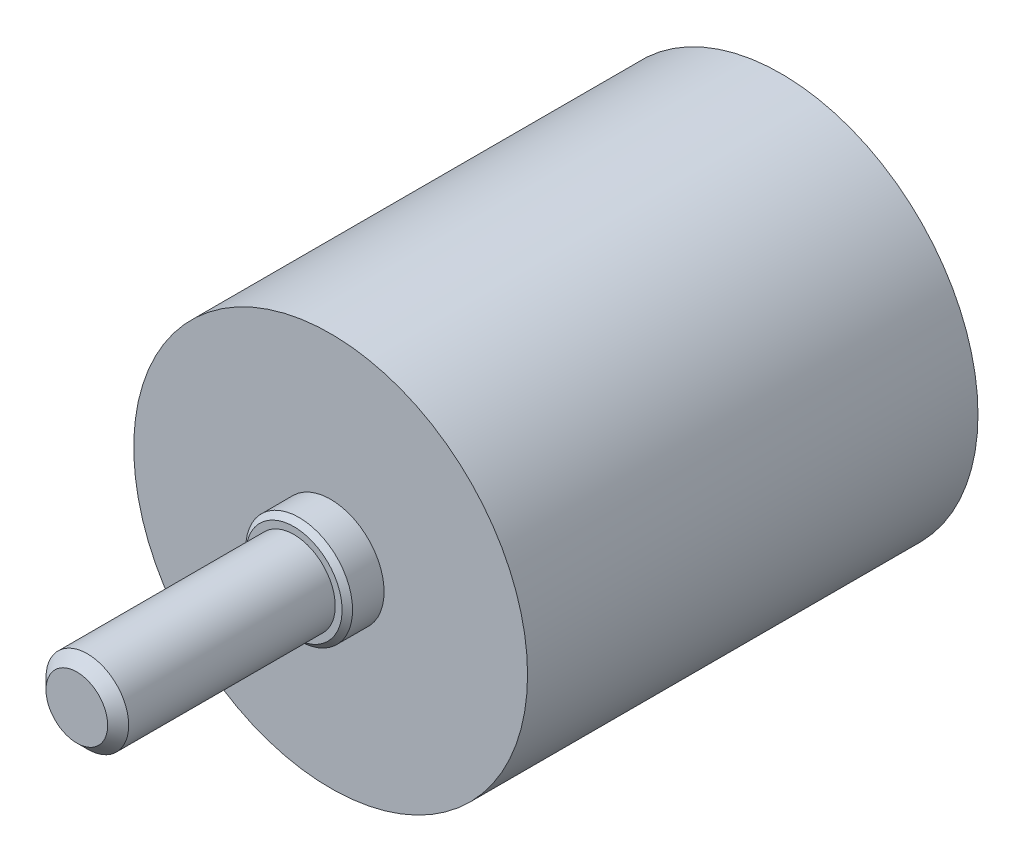
ISO-10303-21;
HEADER;
FILE_DESCRIPTION(('STEP AP214'),'2;1');
FILE_NAME('part.step','',(''),(''),'','','');
FILE_SCHEMA(('AUTOMOTIVE_DESIGN { 1 0 10303 214 1 1 1 1 }'));
ENDSEC;
DATA;
#1=APPLICATION_CONTEXT('core data for automotive mechanical design processes');
#2=APPLICATION_PROTOCOL_DEFINITION('international standard','automotive_design',2000,#1);
#3=PRODUCT_CONTEXT('',#1,'mechanical');
#4=PRODUCT('Part','Part','',(#3));
#5=PRODUCT_RELATED_PRODUCT_CATEGORY('part','',(#4));
#6=PRODUCT_DEFINITION_FORMATION('','',#4);
#7=PRODUCT_DEFINITION_CONTEXT('part definition',#1,'design');
#8=PRODUCT_DEFINITION('design','',#6,#7);
#9=PRODUCT_DEFINITION_SHAPE('','',#8);
#10=(LENGTH_UNIT() NAMED_UNIT(*) SI_UNIT(.MILLI.,.METRE.));
#11=(NAMED_UNIT(*) PLANE_ANGLE_UNIT() SI_UNIT($,.RADIAN.));
#12=(NAMED_UNIT(*) SI_UNIT($,.STERADIAN.) SOLID_ANGLE_UNIT());
#13=UNCERTAINTY_MEASURE_WITH_UNIT(LENGTH_MEASURE(1.E-05),#10,'distance_accuracy_value','');
#14=(GEOMETRIC_REPRESENTATION_CONTEXT(3) GLOBAL_UNCERTAINTY_ASSIGNED_CONTEXT((#13)) GLOBAL_UNIT_ASSIGNED_CONTEXT((#10,
#11,#12)) REPRESENTATION_CONTEXT('',''));
#15=CARTESIAN_POINT('',(0.,0.,0.));
#16=DIRECTION('',(0.,0.,1.));
#17=DIRECTION('',(1.,0.,0.));
#18=AXIS2_PLACEMENT_3D('',#15,#16,#17);
#19=CARTESIAN_POINT('',(0.,0.,0.));
#20=DIRECTION('',(0.,0.,-1.));
#21=DIRECTION('',(-1.,0.,0.));
#22=AXIS2_PLACEMENT_3D('',#19,#20,#21);
#23=PLANE('',#22);
#24=CARTESIAN_POINT('',(0.,0.,0.));
#25=DIRECTION('',(0.,0.,-1.));
#26=DIRECTION('',(-1.,0.,0.));
#27=AXIS2_PLACEMENT_3D('',#24,#25,#26);
#28=CIRCLE('',#27,2.984);
#29=CARTESIAN_POINT('',(-2.984,0.,0.));
#30=VERTEX_POINT('',#29);
#31=EDGE_CURVE('E60',#30,#30,#28,.F.);
#32=ORIENTED_EDGE('',*,*,#31,.T.);
#33=EDGE_LOOP('',(#32));
#34=FACE_BOUND('',#33,.T.);
#35=ADVANCED_FACE('F37',(#34),#23,.F.);
#36=CARTESIAN_POINT('',(0.,0.,0.));
#37=DIRECTION('',(0.,0.,1.));
#38=DIRECTION('',(1.,0.,0.));
#39=AXIS2_PLACEMENT_3D('',#36,#37,#38);
#40=CYLINDRICAL_SURFACE('',#39,4.);
#41=CARTESIAN_POINT('',(0.,0.,-1.016));
#42=DIRECTION('',(0.,0.,-1.));
#43=DIRECTION('',(-1.,0.,0.));
#44=AXIS2_PLACEMENT_3D('',#41,#42,#43);
#45=CIRCLE('',#44,4.);
#46=CARTESIAN_POINT('',(-4.,0.,-1.016));
#47=VERTEX_POINT('',#46);
#48=EDGE_CURVE('E57',#47,#47,#45,.T.);
#49=ORIENTED_EDGE('',*,*,#48,.T.);
#50=EDGE_LOOP('',(#49));
#51=FACE_BOUND('',#50,.T.);
#52=CARTESIAN_POINT('',(0.,0.,-21.));
#53=DIRECTION('',(0.,0.,1.));
#54=DIRECTION('',(1.,0.,0.));
#55=AXIS2_PLACEMENT_3D('',#52,#53,#54);
#56=CIRCLE('',#55,4.);
#57=CARTESIAN_POINT('',(4.,0.,-21.));
#58=VERTEX_POINT('',#57);
#59=EDGE_CURVE('E63',#58,#58,#56,.T.);
#60=ORIENTED_EDGE('',*,*,#59,.T.);
#61=EDGE_LOOP('',(#60));
#62=FACE_BOUND('',#61,.T.);
#63=ADVANCED_FACE('F98',(#51,#62),#40,.T.);
#64=CARTESIAN_POINT('',(0.,4.,-21.));
#65=DIRECTION('',(0.,0.,-1.));
#66=DIRECTION('',(-1.,0.,0.));
#67=AXIS2_PLACEMENT_3D('',#64,#65,#66);
#68=PLANE('',#67);
#69=CARTESIAN_POINT('',(0.,0.,-21.));
#70=DIRECTION('',(0.,0.,-1.));
#71=DIRECTION('',(-1.,0.,0.));
#72=AXIS2_PLACEMENT_3D('',#69,#70,#71);
#73=CIRCLE('',#72,4.66090000000001);
#74=CARTESIAN_POINT('',(-4.66090000000001,0.,-21.));
#75=VERTEX_POINT('',#74);
#76=EDGE_CURVE('E44',#75,#75,#73,.F.);
#77=ORIENTED_EDGE('',*,*,#76,.T.);
#78=EDGE_LOOP('',(#77));
#79=FACE_BOUND('',#78,.T.);
#80=ORIENTED_EDGE('',*,*,#59,.F.);
#81=EDGE_LOOP('',(#80));
#82=FACE_BOUND('',#81,.T.);
#83=ADVANCED_FACE('F104',(#79,#82),#68,.F.);
#84=CARTESIAN_POINT('',(0.,0.,0.));
#85=DIRECTION('',(0.,0.,1.));
#86=DIRECTION('',(1.,0.,0.));
#87=AXIS2_PLACEMENT_3D('',#84,#85,#86);
#88=CYLINDRICAL_SURFACE('',#87,5.1689);
#89=CARTESIAN_POINT('',(0.,0.,-21.508));
#90=DIRECTION('',(0.,0.,-1.));
#91=DIRECTION('',(-1.,0.,0.));
#92=AXIS2_PLACEMENT_3D('',#89,#90,#91);
#93=CIRCLE('',#92,5.1689);
#94=CARTESIAN_POINT('',(-5.1689,0.,-21.508));
#95=VERTEX_POINT('',#94);
#96=EDGE_CURVE('E10',#95,#95,#93,.T.);
#97=ORIENTED_EDGE('',*,*,#96,.T.);
#98=EDGE_LOOP('',(#97));
#99=FACE_BOUND('',#98,.T.);
#100=CARTESIAN_POINT('',(0.,0.,-24.556));
#101=DIRECTION('',(0.,0.,1.));
#102=DIRECTION('',(1.,0.,0.));
#103=AXIS2_PLACEMENT_3D('',#100,#101,#102);
#104=CIRCLE('',#103,5.1689);
#105=CARTESIAN_POINT('',(5.1689,0.,-24.556));
#106=VERTEX_POINT('',#105);
#107=EDGE_CURVE('E66',#106,#106,#104,.T.);
#108=ORIENTED_EDGE('',*,*,#107,.T.);
#109=EDGE_LOOP('',(#108));
#110=FACE_BOUND('',#109,.T.);
#111=ADVANCED_FACE('F171',(#99,#110),#88,.T.);
#112=CARTESIAN_POINT('',(0.,5.1689,-24.556));
#113=DIRECTION('',(0.,0.,-1.));
#114=DIRECTION('',(-1.,0.,0.));
#115=AXIS2_PLACEMENT_3D('',#112,#113,#114);
#116=PLANE('',#115);
#117=ORIENTED_EDGE('',*,*,#107,.F.);
#118=EDGE_LOOP('',(#117));
#119=FACE_BOUND('',#118,.T.);
#120=CARTESIAN_POINT('',(0.,0.,-24.556));
#121=DIRECTION('',(0.,0.,1.));
#122=DIRECTION('',(1.,0.,0.));
#123=AXIS2_PLACEMENT_3D('',#120,#121,#122);
#124=CIRCLE('',#123,19.05);
#125=CARTESIAN_POINT('',(19.05,0.,-24.556));
#126=VERTEX_POINT('',#125);
#127=EDGE_CURVE('E69',#126,#126,#124,.T.);
#128=ORIENTED_EDGE('',*,*,#127,.T.);
#129=EDGE_LOOP('',(#128));
#130=FACE_BOUND('',#129,.T.);
#131=ADVANCED_FACE('F161',(#119,#130),#116,.F.);
#132=CARTESIAN_POINT('',(0.,0.,0.));
#133=DIRECTION('',(0.,0.,1.));
#134=DIRECTION('',(1.,0.,0.));
#135=AXIS2_PLACEMENT_3D('',#132,#133,#134);
#136=CYLINDRICAL_SURFACE('',#135,19.05);
#137=ORIENTED_EDGE('',*,*,#127,.F.);
#138=EDGE_LOOP('',(#137));
#139=FACE_BOUND('',#138,.T.);
#140=CARTESIAN_POINT('',(0.,0.,-68.1347493653523));
#141=DIRECTION('',(0.,0.,1.));
#142=DIRECTION('',(1.,0.,0.));
#143=AXIS2_PLACEMENT_3D('',#140,#141,#142);
#144=CIRCLE('',#143,19.05);
#145=CARTESIAN_POINT('',(19.05,0.,-68.1347493653523));
#146=VERTEX_POINT('',#145);
#147=EDGE_CURVE('E72',#146,#146,#144,.T.);
#148=ORIENTED_EDGE('',*,*,#147,.T.);
#149=EDGE_LOOP('',(#148));
#150=FACE_BOUND('',#149,.T.);
#151=ADVANCED_FACE('F94',(#139,#150),#136,.T.);
#152=CARTESIAN_POINT('',(0.,19.05,-68.1347493653523));
#153=DIRECTION('',(0.,0.,1.));
#154=DIRECTION('',(1.,0.,0.));
#155=AXIS2_PLACEMENT_3D('',#152,#153,#154);
#156=PLANE('',#155);
#157=ORIENTED_EDGE('',*,*,#147,.F.);
#158=EDGE_LOOP('',(#157));
#159=FACE_BOUND('',#158,.T.);
#160=CARTESIAN_POINT('',(0.,0.,-68.1347493653523));
#161=DIRECTION('',(0.,0.,1.));
#162=DIRECTION('',(1.,0.,0.));
#163=AXIS2_PLACEMENT_3D('',#160,#161,#162);
#164=CIRCLE('',#163,5.1689);
#165=CARTESIAN_POINT('',(5.1689,0.,-68.1347493653523));
#166=VERTEX_POINT('',#165);
#167=EDGE_CURVE('E75',#166,#166,#164,.T.);
#168=ORIENTED_EDGE('',*,*,#167,.T.);
#169=EDGE_LOOP('',(#168));
#170=FACE_BOUND('',#169,.T.);
#171=ADVANCED_FACE('F79',(#159,#170),#156,.F.);
#172=CARTESIAN_POINT('',(0.,0.,0.));
#173=DIRECTION('',(0.,0.,1.));
#174=DIRECTION('',(1.,0.,0.));
#175=AXIS2_PLACEMENT_3D('',#172,#173,#174);
#176=CYLINDRICAL_SURFACE('',#175,5.1689);
#177=CARTESIAN_POINT('',(0.,0.,-72.2884));
#178=DIRECTION('',(0.,0.,1.));
#179=DIRECTION('',(1.,0.,0.));
#180=AXIS2_PLACEMENT_3D('',#177,#178,#179);
#181=CIRCLE('',#180,5.1689);
#182=CARTESIAN_POINT('',(5.1689,0.,-72.2884));
#183=VERTEX_POINT('',#182);
#184=EDGE_CURVE('E52',#183,#183,#181,.T.);
#185=ORIENTED_EDGE('',*,*,#184,.T.);
#186=EDGE_LOOP('',(#185));
#187=FACE_BOUND('',#186,.T.);
#188=ORIENTED_EDGE('',*,*,#167,.F.);
#189=EDGE_LOOP('',(#188));
#190=FACE_BOUND('',#189,.T.);
#191=ADVANCED_FACE('F81',(#187,#190),#176,.T.);
#192=CARTESIAN_POINT('',(0.,5.1689,-72.7964));
#193=DIRECTION('',(0.,0.,1.));
#194=DIRECTION('',(1.,0.,0.));
#195=AXIS2_PLACEMENT_3D('',#192,#193,#194);
#196=PLANE('',#195);
#197=CARTESIAN_POINT('',(0.,0.,-72.7964));
#198=DIRECTION('',(0.,0.,1.));
#199=DIRECTION('',(1.,0.,0.));
#200=AXIS2_PLACEMENT_3D('',#197,#198,#199);
#201=CIRCLE('',#200,4.66089999999999);
#202=CARTESIAN_POINT('',(4.66089999999999,0.,-72.7964));
#203=VERTEX_POINT('',#202);
#204=EDGE_CURVE('E48',#203,#203,#201,.F.);
#205=ORIENTED_EDGE('',*,*,#204,.T.);
#206=EDGE_LOOP('',(#205));
#207=FACE_BOUND('',#206,.T.);
#208=ADVANCED_FACE('F83',(#207),#196,.F.);
#209=CARTESIAN_POINT('',(0.,0.,0.));
#210=DIRECTION('',(0.,0.,-1.));
#211=DIRECTION('',(-1.,0.,0.));
#212=AXIS2_PLACEMENT_3D('',#209,#210,#211);
#213=CONICAL_SURFACE('',#212,2.984,0.785398163397448);
#214=ORIENTED_EDGE('',*,*,#48,.F.);
#215=EDGE_LOOP('',(#214));
#216=FACE_BOUND('',#215,.T.);
#217=ORIENTED_EDGE('',*,*,#31,.F.);
#218=EDGE_LOOP('',(#217));
#219=FACE_BOUND('',#218,.T.);
#220=ADVANCED_FACE('F90',(#216,#219),#213,.T.);
#221=CARTESIAN_POINT('',(0.,0.,-72.2884));
#222=DIRECTION('',(0.,0.,1.));
#223=DIRECTION('',(1.,0.,0.));
#224=AXIS2_PLACEMENT_3D('',#221,#222,#223);
#225=CONICAL_SURFACE('',#224,5.1689,0.785398163397453);
#226=ORIENTED_EDGE('',*,*,#204,.F.);
#227=EDGE_LOOP('',(#226));
#228=FACE_BOUND('',#227,.T.);
#229=ORIENTED_EDGE('',*,*,#184,.F.);
#230=EDGE_LOOP('',(#229));
#231=FACE_BOUND('',#230,.T.);
#232=ADVANCED_FACE('F110',(#228,#231),#225,.T.);
#233=CARTESIAN_POINT('',(0.,0.,-21.));
#234=DIRECTION('',(0.,0.,-1.));
#235=DIRECTION('',(-1.,0.,0.));
#236=AXIS2_PLACEMENT_3D('',#233,#234,#235);
#237=CONICAL_SURFACE('',#236,4.66090000000001,0.785398163397458);
#238=ORIENTED_EDGE('',*,*,#96,.F.);
#239=EDGE_LOOP('',(#238));
#240=FACE_BOUND('',#239,.T.);
#241=ORIENTED_EDGE('',*,*,#76,.F.);
#242=EDGE_LOOP('',(#241));
#243=FACE_BOUND('',#242,.T.);
#244=ADVANCED_FACE('F39',(#240,#243),#237,.T.);
#245=CLOSED_SHELL('',(#35,#63,#83,#111,#131,#151,#171,#191,#208,#220,#232,#244));
#246=MANIFOLD_SOLID_BREP('B2',#245);
#247=ADVANCED_BREP_SHAPE_REPRESENTATION('',(#18,#246),#14);
#248=SHAPE_DEFINITION_REPRESENTATION(#9,#247);
ENDSEC;
END-ISO-10303-21;
